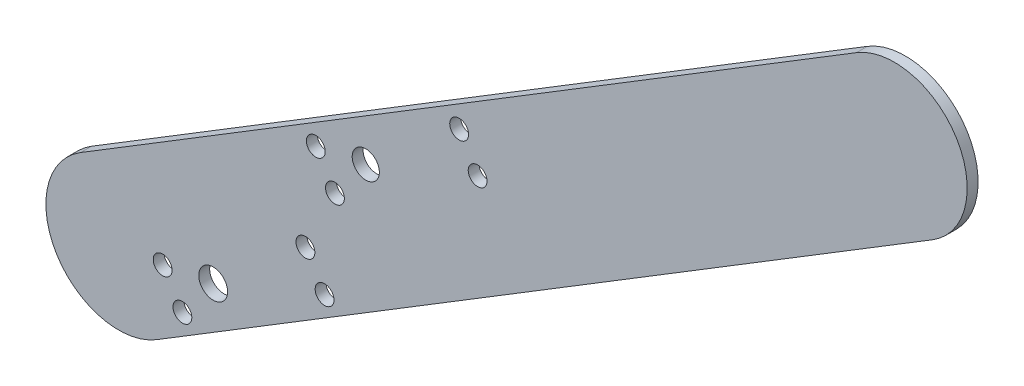
ISO-10303-21;
HEADER;
FILE_DESCRIPTION(('STEP AP214'),'2;1');
FILE_NAME('part.step','',(''),(''),'','','');
FILE_SCHEMA(('AUTOMOTIVE_DESIGN { 1 0 10303 214 1 1 1 1 }'));
ENDSEC;
DATA;
#1=APPLICATION_CONTEXT('core data for automotive mechanical design processes');
#2=APPLICATION_PROTOCOL_DEFINITION('international standard','automotive_design',2000,#1);
#3=PRODUCT_CONTEXT('',#1,'mechanical');
#4=PRODUCT('Part','Part','',(#3));
#5=PRODUCT_RELATED_PRODUCT_CATEGORY('part','',(#4));
#6=PRODUCT_DEFINITION_FORMATION('','',#4);
#7=PRODUCT_DEFINITION_CONTEXT('part definition',#1,'design');
#8=PRODUCT_DEFINITION('design','',#6,#7);
#9=PRODUCT_DEFINITION_SHAPE('','',#8);
#10=(LENGTH_UNIT() NAMED_UNIT(*) SI_UNIT(.MILLI.,.METRE.));
#11=(NAMED_UNIT(*) PLANE_ANGLE_UNIT() SI_UNIT($,.RADIAN.));
#12=(NAMED_UNIT(*) SI_UNIT($,.STERADIAN.) SOLID_ANGLE_UNIT());
#13=UNCERTAINTY_MEASURE_WITH_UNIT(LENGTH_MEASURE(1.E-05),#10,'distance_accuracy_value','');
#14=(GEOMETRIC_REPRESENTATION_CONTEXT(3) GLOBAL_UNCERTAINTY_ASSIGNED_CONTEXT((#13)) GLOBAL_UNIT_ASSIGNED_CONTEXT((#10,
#11,#12)) REPRESENTATION_CONTEXT('',''));
#15=CARTESIAN_POINT('',(0.,0.,0.));
#16=DIRECTION('',(0.,0.,1.));
#17=DIRECTION('',(1.,0.,0.));
#18=AXIS2_PLACEMENT_3D('',#15,#16,#17);
#19=CARTESIAN_POINT('',(-36.7942204843692,27.5637149226381,-3.));
#20=DIRECTION('',(0.,0.,1.));
#21=DIRECTION('',(1.,0.,0.));
#22=AXIS2_PLACEMENT_3D('',#19,#20,#21);
#23=CYLINDRICAL_SURFACE('',#22,20.);
#24=CARTESIAN_POINT('',(-36.7942204843692,27.5637149226381,0.));
#25=DIRECTION('',(0.,0.,1.));
#26=DIRECTION('',(1.,0.,0.));
#27=AXIS2_PLACEMENT_3D('',#24,#25,#26);
#28=CIRCLE('',#27,20.);
#29=CARTESIAN_POINT('',(-47.2280427896707,44.6264038110107,0.));
#30=VERTEX_POINT('',#29);
#31=CARTESIAN_POINT('',(-26.3603981790677,10.5010260342655,0.));
#32=VERTEX_POINT('',#31);
#33=EDGE_CURVE('E103',#30,#32,#28,.T.);
#34=ORIENTED_EDGE('',*,*,#33,.F.);
#35=DIRECTION('',(0.,0.,1.));
#36=VECTOR('',#35,1.);
#37=CARTESIAN_POINT('',(-47.2280427896707,44.6264038110107,-3.));
#38=LINE('',#37,#36);
#39=CARTESIAN_POINT('',(-47.2280427896707,44.6264038110107,-3.));
#40=VERTEX_POINT('',#39);
#41=EDGE_CURVE('E11',#40,#30,#38,.T.);
#42=ORIENTED_EDGE('',*,*,#41,.F.);
#43=CARTESIAN_POINT('',(-36.7942204843692,27.5637149226381,-3.));
#44=DIRECTION('',(0.,0.,1.));
#45=DIRECTION('',(1.,0.,0.));
#46=AXIS2_PLACEMENT_3D('',#43,#44,#45);
#47=CIRCLE('',#46,20.);
#48=CARTESIAN_POINT('',(-26.3603981790677,10.5010260342655,-3.));
#49=VERTEX_POINT('',#48);
#50=EDGE_CURVE('E96',#40,#49,#47,.T.);
#51=ORIENTED_EDGE('',*,*,#50,.T.);
#52=DIRECTION('',(0.,0.,1.));
#53=VECTOR('',#52,1.);
#54=CARTESIAN_POINT('',(-26.3603981790677,10.5010260342655,-3.));
#55=LINE('',#54,#53);
#56=EDGE_CURVE('E79',#49,#32,#55,.T.);
#57=ORIENTED_EDGE('',*,*,#56,.T.);
#58=EDGE_LOOP('',(#34,#42,#51,#57));
#59=FACE_BOUND('',#58,.T.);
#60=ADVANCED_FACE('F36',(#59),#23,.T.);
#61=CARTESIAN_POINT('',(-47.2280427896707,44.6264038110107,-3.));
#62=DIRECTION('',(-0.521691115265075,0.853134444418629,0.));
#63=DIRECTION('',(-0.853134444418629,-0.521691115265075,0.));
#64=AXIS2_PLACEMENT_3D('',#61,#62,#63);
#65=PLANE('',#64);
#66=DIRECTION('',(-0.853134444418629,-0.521691115265075,0.));
#67=VECTOR('',#66,1.);
#68=CARTESIAN_POINT('',(-47.2280427896707,44.6264038110107,0.));
#69=LINE('',#68,#67);
#70=CARTESIAN_POINT('',(166.055568314986,175.049182627279,0.));
#71=VERTEX_POINT('',#70);
#72=EDGE_CURVE('E98',#71,#30,#69,.T.);
#73=ORIENTED_EDGE('',*,*,#72,.F.);
#74=DIRECTION('',(0.,0.,1.));
#75=VECTOR('',#74,1.);
#76=CARTESIAN_POINT('',(166.055568314986,175.049182627279,-3.));
#77=LINE('',#76,#75);
#78=CARTESIAN_POINT('',(166.055568314986,175.049182627279,-3.));
#79=VERTEX_POINT('',#78);
#80=EDGE_CURVE('E45',#79,#71,#77,.T.);
#81=ORIENTED_EDGE('',*,*,#80,.F.);
#82=DIRECTION('',(-0.853134444418629,-0.521691115265075,0.));
#83=VECTOR('',#82,1.);
#84=CARTESIAN_POINT('',(-47.2280427896707,44.6264038110107,-3.));
#85=LINE('',#84,#83);
#86=EDGE_CURVE('E93',#79,#40,#85,.T.);
#87=ORIENTED_EDGE('',*,*,#86,.T.);
#88=ORIENTED_EDGE('',*,*,#41,.T.);
#89=EDGE_LOOP('',(#73,#81,#87,#88));
#90=FACE_BOUND('',#89,.T.);
#91=ADVANCED_FACE('F114',(#90),#65,.T.);
#92=CARTESIAN_POINT('',(176.489390620288,157.986493738907,-3.));
#93=DIRECTION('',(0.,0.,1.));
#94=DIRECTION('',(1.,0.,0.));
#95=AXIS2_PLACEMENT_3D('',#92,#93,#94);
#96=CYLINDRICAL_SURFACE('',#95,20.);
#97=CARTESIAN_POINT('',(176.489390620288,157.986493738907,0.));
#98=DIRECTION('',(0.,0.,1.));
#99=DIRECTION('',(1.,0.,0.));
#100=AXIS2_PLACEMENT_3D('',#97,#98,#99);
#101=CIRCLE('',#100,20.);
#102=CARTESIAN_POINT('',(186.923212925589,140.923804850534,0.));
#103=VERTEX_POINT('',#102);
#104=EDGE_CURVE('E87',#103,#71,#101,.T.);
#105=ORIENTED_EDGE('',*,*,#104,.F.);
#106=DIRECTION('',(0.,0.,1.));
#107=VECTOR('',#106,1.);
#108=CARTESIAN_POINT('',(186.923212925589,140.923804850534,-3.));
#109=LINE('',#108,#107);
#110=CARTESIAN_POINT('',(186.923212925589,140.923804850534,-3.));
#111=VERTEX_POINT('',#110);
#112=EDGE_CURVE('E82',#111,#103,#109,.T.);
#113=ORIENTED_EDGE('',*,*,#112,.F.);
#114=CARTESIAN_POINT('',(176.489390620288,157.986493738907,-3.));
#115=DIRECTION('',(0.,0.,1.));
#116=DIRECTION('',(1.,0.,0.));
#117=AXIS2_PLACEMENT_3D('',#114,#115,#116);
#118=CIRCLE('',#117,20.);
#119=EDGE_CURVE('E85',#111,#79,#118,.T.);
#120=ORIENTED_EDGE('',*,*,#119,.T.);
#121=ORIENTED_EDGE('',*,*,#80,.T.);
#122=EDGE_LOOP('',(#105,#113,#120,#121));
#123=FACE_BOUND('',#122,.T.);
#124=ADVANCED_FACE('F84',(#123),#96,.T.);
#125=CARTESIAN_POINT('',(-26.3603981790677,10.5010260342655,-3.));
#126=DIRECTION('',(0.521691115265075,-0.853134444418629,0.));
#127=DIRECTION('',(0.853134444418629,0.521691115265075,0.));
#128=AXIS2_PLACEMENT_3D('',#125,#126,#127);
#129=PLANE('',#128);
#130=DIRECTION('',(0.853134444418629,0.521691115265075,0.));
#131=VECTOR('',#130,1.);
#132=CARTESIAN_POINT('',(-26.3603981790677,10.5010260342655,0.));
#133=LINE('',#132,#131);
#134=EDGE_CURVE('E106',#32,#103,#133,.T.);
#135=ORIENTED_EDGE('',*,*,#134,.F.);
#136=ORIENTED_EDGE('',*,*,#56,.F.);
#137=DIRECTION('',(0.853134444418629,0.521691115265075,0.));
#138=VECTOR('',#137,1.);
#139=CARTESIAN_POINT('',(-26.3603981790677,10.5010260342655,-3.));
#140=LINE('',#139,#138);
#141=EDGE_CURVE('E92',#49,#111,#140,.T.);
#142=ORIENTED_EDGE('',*,*,#141,.T.);
#143=ORIENTED_EDGE('',*,*,#112,.T.);
#144=EDGE_LOOP('',(#135,#136,#142,#143));
#145=FACE_BOUND('',#144,.T.);
#146=ADVANCED_FACE('F95',(#145),#129,.T.);
#147=CARTESIAN_POINT('',(-36.7942204843692,27.5637149226381,-3.));
#148=DIRECTION('',(0.,0.,1.));
#149=DIRECTION('',(1.,0.,0.));
#150=AXIS2_PLACEMENT_3D('',#147,#148,#149);
#151=PLANE('',#150);
#152=CARTESIAN_POINT('',(-10.8048046568197,31.6363680947038,-3.));
#153=DIRECTION('',(0.,0.,-1.));
#154=DIRECTION('',(-1.,0.,0.));
#155=AXIS2_PLACEMENT_3D('',#152,#153,#154);
#156=CIRCLE('',#155,3.96230252813796);
#157=CARTESIAN_POINT('',(-14.7671071849576,31.6363680947038,-3.));
#158=VERTEX_POINT('',#157);
#159=EDGE_CURVE('E182',#158,#158,#156,.T.);
#160=ORIENTED_EDGE('',*,*,#159,.F.);
#161=EDGE_LOOP('',(#160));
#162=FACE_BOUND('',#161,.T.);
#163=CARTESIAN_POINT('',(19.8205891481797,44.3231531850654,-3.));
#164=DIRECTION('',(0.,0.,1.));
#165=DIRECTION('',(1.,0.,0.));
#166=AXIS2_PLACEMENT_3D('',#163,#164,#165);
#167=CIRCLE('',#166,2.5908);
#168=CARTESIAN_POINT('',(22.4113891481797,44.3231531850654,-3.));
#169=VERTEX_POINT('',#168);
#170=EDGE_CURVE('E188',#169,#169,#167,.T.);
#171=ORIENTED_EDGE('',*,*,#170,.T.);
#172=EDGE_LOOP('',(#171));
#173=FACE_BOUND('',#172,.T.);
#174=CARTESIAN_POINT('',(14.5593622767743,52.9693766436865,-3.));
#175=DIRECTION('',(0.,0.,1.));
#176=DIRECTION('',(1.,0.,0.));
#177=AXIS2_PLACEMENT_3D('',#174,#175,#176);
#178=CIRCLE('',#177,2.5908);
#179=CARTESIAN_POINT('',(17.1501622767743,52.9693766436865,-3.));
#180=VERTEX_POINT('',#179);
#181=EDGE_CURVE('E194',#180,#180,#178,.T.);
#182=ORIENTED_EDGE('',*,*,#181,.T.);
#183=EDGE_LOOP('',(#182));
#184=FACE_BOUND('',#183,.T.);
#185=CARTESIAN_POINT('',(-19.270561455125,20.5799823861223,-3.));
#186=DIRECTION('',(0.,0.,1.));
#187=DIRECTION('',(1.,0.,0.));
#188=AXIS2_PLACEMENT_3D('',#185,#186,#187);
#189=CIRCLE('',#188,2.5908);
#190=CARTESIAN_POINT('',(-16.679761455125,20.5799823861223,-3.));
#191=VERTEX_POINT('',#190);
#192=EDGE_CURVE('E200',#191,#191,#189,.T.);
#193=ORIENTED_EDGE('',*,*,#192,.T.);
#194=EDGE_LOOP('',(#193));
#195=FACE_BOUND('',#194,.T.);
#196=CARTESIAN_POINT('',(-24.6927741505114,29.137979437738,-3.));
#197=DIRECTION('',(0.,0.,1.));
#198=DIRECTION('',(1.,0.,0.));
#199=AXIS2_PLACEMENT_3D('',#196,#197,#198);
#200=CIRCLE('',#199,2.5908);
#201=CARTESIAN_POINT('',(-22.1019741505114,29.137979437738,-3.));
#202=VERTEX_POINT('',#201);
#203=EDGE_CURVE('E206',#202,#202,#200,.T.);
#204=ORIENTED_EDGE('',*,*,#203,.T.);
#205=EDGE_LOOP('',(#204));
#206=FACE_BOUND('',#205,.T.);
#207=CARTESIAN_POINT('',(56.8180825289577,102.219704657662,-3.));
#208=DIRECTION('',(0.,0.,-1.));
#209=DIRECTION('',(-1.,0.,0.));
#210=AXIS2_PLACEMENT_3D('',#207,#208,#209);
#211=CIRCLE('',#210,2.59079999999999);
#212=CARTESIAN_POINT('',(54.2272825289577,102.219704657662,-3.));
#213=VERTEX_POINT('',#212);
#214=EDGE_CURVE('E209',#213,#213,#211,.T.);
#215=ORIENTED_EDGE('',*,*,#214,.F.);
#216=EDGE_LOOP('',(#215));
#217=FACE_BOUND('',#216,.T.);
#218=CARTESIAN_POINT('',(61.8999478493993,93.6512150533639,-3.));
#219=DIRECTION('',(0.,0.,-1.));
#220=DIRECTION('',(-1.,0.,0.));
#221=AXIS2_PLACEMENT_3D('',#218,#219,#220);
#222=CIRCLE('',#221,2.59079999999999);
#223=CARTESIAN_POINT('',(59.3091478493994,93.6512150533639,-3.));
#224=VERTEX_POINT('',#223);
#225=EDGE_CURVE('E215',#224,#224,#222,.T.);
#226=ORIENTED_EDGE('',*,*,#225,.F.);
#227=EDGE_LOOP('',(#226));
#228=FACE_BOUND('',#227,.T.);
#229=CARTESIAN_POINT('',(17.4078801984567,78.4390046473438,-3.));
#230=DIRECTION('',(0.,0.,-1.));
#231=DIRECTION('',(-1.,0.,0.));
#232=AXIS2_PLACEMENT_3D('',#229,#230,#231);
#233=CIRCLE('',#232,2.59079999999999);
#234=CARTESIAN_POINT('',(14.8170801984568,78.4390046473438,-3.));
#235=VERTEX_POINT('',#234);
#236=EDGE_CURVE('E221',#235,#235,#233,.T.);
#237=ORIENTED_EDGE('',*,*,#236,.F.);
#238=EDGE_LOOP('',(#237));
#239=FACE_BOUND('',#238,.T.);
#240=CARTESIAN_POINT('',(22.6711021438295,69.9046738627243,-3.));
#241=DIRECTION('',(0.,0.,-1.));
#242=DIRECTION('',(-1.,0.,0.));
#243=AXIS2_PLACEMENT_3D('',#240,#241,#242);
#244=CIRCLE('',#243,2.59079999999999);
#245=CARTESIAN_POINT('',(20.0803021438295,69.9046738627243,-3.));
#246=VERTEX_POINT('',#245);
#247=EDGE_CURVE('E227',#246,#246,#244,.T.);
#248=ORIENTED_EDGE('',*,*,#247,.F.);
#249=EDGE_LOOP('',(#248));
#250=FACE_BOUND('',#249,.T.);
#251=CARTESIAN_POINT('',(31.1454800490054,80.9702923119815,-3.));
#252=DIRECTION('',(0.,0.,1.));
#253=DIRECTION('',(1.,0.,0.));
#254=AXIS2_PLACEMENT_3D('',#251,#252,#253);
#255=CIRCLE('',#254,3.73170575625892);
#256=CARTESIAN_POINT('',(34.8771858052643,80.9702923119815,-3.));
#257=VERTEX_POINT('',#256);
#258=EDGE_CURVE('E107',#257,#257,#255,.T.);
#259=ORIENTED_EDGE('',*,*,#258,.T.);
#260=EDGE_LOOP('',(#259));
#261=FACE_BOUND('',#260,.T.);
#262=ORIENTED_EDGE('',*,*,#50,.F.);
#263=ORIENTED_EDGE('',*,*,#86,.F.);
#264=ORIENTED_EDGE('',*,*,#119,.F.);
#265=ORIENTED_EDGE('',*,*,#141,.F.);
#266=EDGE_LOOP('',(#262,#263,#264,#265));
#267=FACE_BOUND('',#266,.T.);
#268=ADVANCED_FACE('F91',(#162,#173,#184,#195,#206,#217,#228,#239,#250,#261,#267),#151,.F.);
#269=CARTESIAN_POINT('',(-36.7942204843692,27.5637149226381,0.));
#270=DIRECTION('',(0.,0.,1.));
#271=DIRECTION('',(1.,0.,0.));
#272=AXIS2_PLACEMENT_3D('',#269,#270,#271);
#273=PLANE('',#272);
#274=CARTESIAN_POINT('',(-10.8048046568197,31.6363680947038,0.));
#275=DIRECTION('',(0.,0.,1.));
#276=DIRECTION('',(1.,0.,0.));
#277=AXIS2_PLACEMENT_3D('',#274,#275,#276);
#278=CIRCLE('',#277,3.96230252813796);
#279=CARTESIAN_POINT('',(-6.84250212868169,31.6363680947038,0.));
#280=VERTEX_POINT('',#279);
#281=EDGE_CURVE('E39',#280,#280,#278,.T.);
#282=ORIENTED_EDGE('',*,*,#281,.F.);
#283=EDGE_LOOP('',(#282));
#284=FACE_BOUND('',#283,.T.);
#285=CARTESIAN_POINT('',(19.8205891481797,44.3231531850654,0.));
#286=DIRECTION('',(0.,0.,1.));
#287=DIRECTION('',(1.,0.,0.));
#288=AXIS2_PLACEMENT_3D('',#285,#286,#287);
#289=CIRCLE('',#288,2.59079999999999);
#290=CARTESIAN_POINT('',(22.4113891481797,44.3231531850654,0.));
#291=VERTEX_POINT('',#290);
#292=EDGE_CURVE('E184',#291,#291,#289,.T.);
#293=ORIENTED_EDGE('',*,*,#292,.F.);
#294=EDGE_LOOP('',(#293));
#295=FACE_BOUND('',#294,.T.);
#296=CARTESIAN_POINT('',(14.5593622767743,52.9693766436865,0.));
#297=DIRECTION('',(0.,0.,1.));
#298=DIRECTION('',(1.,0.,0.));
#299=AXIS2_PLACEMENT_3D('',#296,#297,#298);
#300=CIRCLE('',#299,2.59079999999999);
#301=CARTESIAN_POINT('',(17.1501622767743,52.9693766436865,0.));
#302=VERTEX_POINT('',#301);
#303=EDGE_CURVE('E191',#302,#302,#300,.T.);
#304=ORIENTED_EDGE('',*,*,#303,.F.);
#305=EDGE_LOOP('',(#304));
#306=FACE_BOUND('',#305,.T.);
#307=CARTESIAN_POINT('',(-19.270561455125,20.5799823861223,0.));
#308=DIRECTION('',(0.,0.,1.));
#309=DIRECTION('',(1.,0.,0.));
#310=AXIS2_PLACEMENT_3D('',#307,#308,#309);
#311=CIRCLE('',#310,2.59079999999999);
#312=CARTESIAN_POINT('',(-16.679761455125,20.5799823861223,0.));
#313=VERTEX_POINT('',#312);
#314=EDGE_CURVE('E197',#313,#313,#311,.T.);
#315=ORIENTED_EDGE('',*,*,#314,.F.);
#316=EDGE_LOOP('',(#315));
#317=FACE_BOUND('',#316,.T.);
#318=CARTESIAN_POINT('',(-24.6927741505114,29.137979437738,0.));
#319=DIRECTION('',(0.,0.,1.));
#320=DIRECTION('',(1.,0.,0.));
#321=AXIS2_PLACEMENT_3D('',#318,#319,#320);
#322=CIRCLE('',#321,2.59079999999999);
#323=CARTESIAN_POINT('',(-22.1019741505114,29.137979437738,0.));
#324=VERTEX_POINT('',#323);
#325=EDGE_CURVE('E203',#324,#324,#322,.T.);
#326=ORIENTED_EDGE('',*,*,#325,.F.);
#327=EDGE_LOOP('',(#326));
#328=FACE_BOUND('',#327,.T.);
#329=CARTESIAN_POINT('',(56.8180825289577,102.219704657662,0.));
#330=DIRECTION('',(0.,0.,-1.));
#331=DIRECTION('',(-1.,0.,0.));
#332=AXIS2_PLACEMENT_3D('',#329,#330,#331);
#333=CIRCLE('',#332,2.5908);
#334=CARTESIAN_POINT('',(54.2272825289577,102.219704657662,0.));
#335=VERTEX_POINT('',#334);
#336=EDGE_CURVE('E212',#335,#335,#333,.T.);
#337=ORIENTED_EDGE('',*,*,#336,.T.);
#338=EDGE_LOOP('',(#337));
#339=FACE_BOUND('',#338,.T.);
#340=CARTESIAN_POINT('',(61.8999478493993,93.6512150533639,0.));
#341=DIRECTION('',(0.,0.,-1.));
#342=DIRECTION('',(-1.,0.,0.));
#343=AXIS2_PLACEMENT_3D('',#340,#341,#342);
#344=CIRCLE('',#343,2.5908);
#345=CARTESIAN_POINT('',(59.3091478493993,93.6512150533639,0.));
#346=VERTEX_POINT('',#345);
#347=EDGE_CURVE('E218',#346,#346,#344,.T.);
#348=ORIENTED_EDGE('',*,*,#347,.T.);
#349=EDGE_LOOP('',(#348));
#350=FACE_BOUND('',#349,.T.);
#351=CARTESIAN_POINT('',(17.4078801984567,78.4390046473438,0.));
#352=DIRECTION('',(0.,0.,-1.));
#353=DIRECTION('',(-1.,0.,0.));
#354=AXIS2_PLACEMENT_3D('',#351,#352,#353);
#355=CIRCLE('',#354,2.5908);
#356=CARTESIAN_POINT('',(14.8170801984567,78.4390046473438,0.));
#357=VERTEX_POINT('',#356);
#358=EDGE_CURVE('E224',#357,#357,#355,.T.);
#359=ORIENTED_EDGE('',*,*,#358,.T.);
#360=EDGE_LOOP('',(#359));
#361=FACE_BOUND('',#360,.T.);
#362=CARTESIAN_POINT('',(22.6711021438295,69.9046738627243,0.));
#363=DIRECTION('',(0.,0.,-1.));
#364=DIRECTION('',(-1.,0.,0.));
#365=AXIS2_PLACEMENT_3D('',#362,#363,#364);
#366=CIRCLE('',#365,2.5908);
#367=CARTESIAN_POINT('',(20.0803021438295,69.9046738627243,0.));
#368=VERTEX_POINT('',#367);
#369=EDGE_CURVE('E230',#368,#368,#366,.T.);
#370=ORIENTED_EDGE('',*,*,#369,.T.);
#371=EDGE_LOOP('',(#370));
#372=FACE_BOUND('',#371,.T.);
#373=CARTESIAN_POINT('',(31.1454800490054,80.9702923119815,0.));
#374=DIRECTION('',(0.,0.,1.));
#375=DIRECTION('',(1.,0.,0.));
#376=AXIS2_PLACEMENT_3D('',#373,#374,#375);
#377=CIRCLE('',#376,3.73170575625892);
#378=CARTESIAN_POINT('',(34.8771858052643,80.9702923119815,0.));
#379=VERTEX_POINT('',#378);
#380=EDGE_CURVE('E233',#379,#379,#377,.T.);
#381=ORIENTED_EDGE('',*,*,#380,.F.);
#382=EDGE_LOOP('',(#381));
#383=FACE_BOUND('',#382,.T.);
#384=ORIENTED_EDGE('',*,*,#33,.T.);
#385=ORIENTED_EDGE('',*,*,#134,.T.);
#386=ORIENTED_EDGE('',*,*,#104,.T.);
#387=ORIENTED_EDGE('',*,*,#72,.T.);
#388=EDGE_LOOP('',(#384,#385,#386,#387));
#389=FACE_BOUND('',#388,.T.);
#390=ADVANCED_FACE('F113',(#284,#295,#306,#317,#328,#339,#350,#361,#372,#383,#389),#273,.T.);
#391=CARTESIAN_POINT('',(31.1454800490054,80.9702923119815,-10.));
#392=DIRECTION('',(0.,0.,1.));
#393=DIRECTION('',(1.,0.,0.));
#394=AXIS2_PLACEMENT_3D('',#391,#392,#393);
#395=CYLINDRICAL_SURFACE('',#394,3.73170575625892);
#396=ORIENTED_EDGE('',*,*,#380,.T.);
#397=EDGE_LOOP('',(#396));
#398=FACE_BOUND('',#397,.T.);
#399=ORIENTED_EDGE('',*,*,#258,.F.);
#400=EDGE_LOOP('',(#399));
#401=FACE_BOUND('',#400,.T.);
#402=ADVANCED_FACE('F133',(#398,#401),#395,.F.);
#403=CARTESIAN_POINT('',(22.6711021438295,69.9046738627243,-3.));
#404=DIRECTION('',(0.,0.,-1.));
#405=DIRECTION('',(-1.,0.,0.));
#406=AXIS2_PLACEMENT_3D('',#403,#404,#405);
#407=CYLINDRICAL_SURFACE('',#406,2.59079999999999);
#408=ORIENTED_EDGE('',*,*,#369,.F.);
#409=EDGE_LOOP('',(#408));
#410=FACE_BOUND('',#409,.T.);
#411=ORIENTED_EDGE('',*,*,#247,.T.);
#412=EDGE_LOOP('',(#411));
#413=FACE_BOUND('',#412,.T.);
#414=ADVANCED_FACE('F140',(#410,#413),#407,.F.);
#415=CARTESIAN_POINT('',(17.4078801984567,78.4390046473438,-3.));
#416=DIRECTION('',(0.,0.,-1.));
#417=DIRECTION('',(-1.,0.,0.));
#418=AXIS2_PLACEMENT_3D('',#415,#416,#417);
#419=CYLINDRICAL_SURFACE('',#418,2.59079999999999);
#420=ORIENTED_EDGE('',*,*,#358,.F.);
#421=EDGE_LOOP('',(#420));
#422=FACE_BOUND('',#421,.T.);
#423=ORIENTED_EDGE('',*,*,#236,.T.);
#424=EDGE_LOOP('',(#423));
#425=FACE_BOUND('',#424,.T.);
#426=ADVANCED_FACE('F144',(#422,#425),#419,.F.);
#427=CARTESIAN_POINT('',(61.8999478493993,93.6512150533639,-3.));
#428=DIRECTION('',(0.,0.,-1.));
#429=DIRECTION('',(-1.,0.,0.));
#430=AXIS2_PLACEMENT_3D('',#427,#428,#429);
#431=CYLINDRICAL_SURFACE('',#430,2.5908);
#432=ORIENTED_EDGE('',*,*,#347,.F.);
#433=EDGE_LOOP('',(#432));
#434=FACE_BOUND('',#433,.T.);
#435=ORIENTED_EDGE('',*,*,#225,.T.);
#436=EDGE_LOOP('',(#435));
#437=FACE_BOUND('',#436,.T.);
#438=ADVANCED_FACE('F148',(#434,#437),#431,.F.);
#439=CARTESIAN_POINT('',(56.8180825289577,102.219704657662,-3.));
#440=DIRECTION('',(0.,0.,-1.));
#441=DIRECTION('',(-1.,0.,0.));
#442=AXIS2_PLACEMENT_3D('',#439,#440,#441);
#443=CYLINDRICAL_SURFACE('',#442,2.59079999999999);
#444=ORIENTED_EDGE('',*,*,#336,.F.);
#445=EDGE_LOOP('',(#444));
#446=FACE_BOUND('',#445,.T.);
#447=ORIENTED_EDGE('',*,*,#214,.T.);
#448=EDGE_LOOP('',(#447));
#449=FACE_BOUND('',#448,.T.);
#450=ADVANCED_FACE('F152',(#446,#449),#443,.F.);
#451=CARTESIAN_POINT('',(-24.6927741505114,29.137979437738,0.));
#452=DIRECTION('',(0.,0.,1.));
#453=DIRECTION('',(1.,0.,0.));
#454=AXIS2_PLACEMENT_3D('',#451,#452,#453);
#455=CYLINDRICAL_SURFACE('',#454,2.59079999999999);
#456=ORIENTED_EDGE('',*,*,#203,.F.);
#457=EDGE_LOOP('',(#456));
#458=FACE_BOUND('',#457,.T.);
#459=ORIENTED_EDGE('',*,*,#325,.T.);
#460=EDGE_LOOP('',(#459));
#461=FACE_BOUND('',#460,.T.);
#462=ADVANCED_FACE('F156',(#458,#461),#455,.F.);
#463=CARTESIAN_POINT('',(-19.270561455125,20.5799823861223,0.));
#464=DIRECTION('',(0.,0.,1.));
#465=DIRECTION('',(1.,0.,0.));
#466=AXIS2_PLACEMENT_3D('',#463,#464,#465);
#467=CYLINDRICAL_SURFACE('',#466,2.59079999999999);
#468=ORIENTED_EDGE('',*,*,#192,.F.);
#469=EDGE_LOOP('',(#468));
#470=FACE_BOUND('',#469,.T.);
#471=ORIENTED_EDGE('',*,*,#314,.T.);
#472=EDGE_LOOP('',(#471));
#473=FACE_BOUND('',#472,.T.);
#474=ADVANCED_FACE('F160',(#470,#473),#467,.F.);
#475=CARTESIAN_POINT('',(14.5593622767743,52.9693766436865,0.));
#476=DIRECTION('',(0.,0.,1.));
#477=DIRECTION('',(1.,0.,0.));
#478=AXIS2_PLACEMENT_3D('',#475,#476,#477);
#479=CYLINDRICAL_SURFACE('',#478,2.59079999999999);
#480=ORIENTED_EDGE('',*,*,#181,.F.);
#481=EDGE_LOOP('',(#480));
#482=FACE_BOUND('',#481,.T.);
#483=ORIENTED_EDGE('',*,*,#303,.T.);
#484=EDGE_LOOP('',(#483));
#485=FACE_BOUND('',#484,.T.);
#486=ADVANCED_FACE('F164',(#482,#485),#479,.F.);
#487=CARTESIAN_POINT('',(19.8205891481797,44.3231531850654,0.));
#488=DIRECTION('',(0.,0.,1.));
#489=DIRECTION('',(1.,0.,0.));
#490=AXIS2_PLACEMENT_3D('',#487,#488,#489);
#491=CYLINDRICAL_SURFACE('',#490,2.59079999999999);
#492=ORIENTED_EDGE('',*,*,#170,.F.);
#493=EDGE_LOOP('',(#492));
#494=FACE_BOUND('',#493,.T.);
#495=ORIENTED_EDGE('',*,*,#292,.T.);
#496=EDGE_LOOP('',(#495));
#497=FACE_BOUND('',#496,.T.);
#498=ADVANCED_FACE('F168',(#494,#497),#491,.F.);
#499=CARTESIAN_POINT('',(-10.8048046568197,31.6363680947038,7.));
#500=DIRECTION('',(0.,0.,-1.));
#501=DIRECTION('',(-1.,0.,0.));
#502=AXIS2_PLACEMENT_3D('',#499,#500,#501);
#503=CYLINDRICAL_SURFACE('',#502,3.96230252813796);
#504=ORIENTED_EDGE('',*,*,#281,.T.);
#505=EDGE_LOOP('',(#504));
#506=FACE_BOUND('',#505,.T.);
#507=ORIENTED_EDGE('',*,*,#159,.T.);
#508=EDGE_LOOP('',(#507));
#509=FACE_BOUND('',#508,.T.);
#510=ADVANCED_FACE('F172',(#506,#509),#503,.F.);
#511=CLOSED_SHELL('',(#60,#91,#124,#146,#268,#390,#402,#414,#426,#438,#450,#462,#474,#486,#498,#510));
#512=MANIFOLD_SOLID_BREP('B2',#511);
#513=ADVANCED_BREP_SHAPE_REPRESENTATION('',(#18,#512),#14);
#514=SHAPE_DEFINITION_REPRESENTATION(#9,#513);
ENDSEC;
END-ISO-10303-21;
